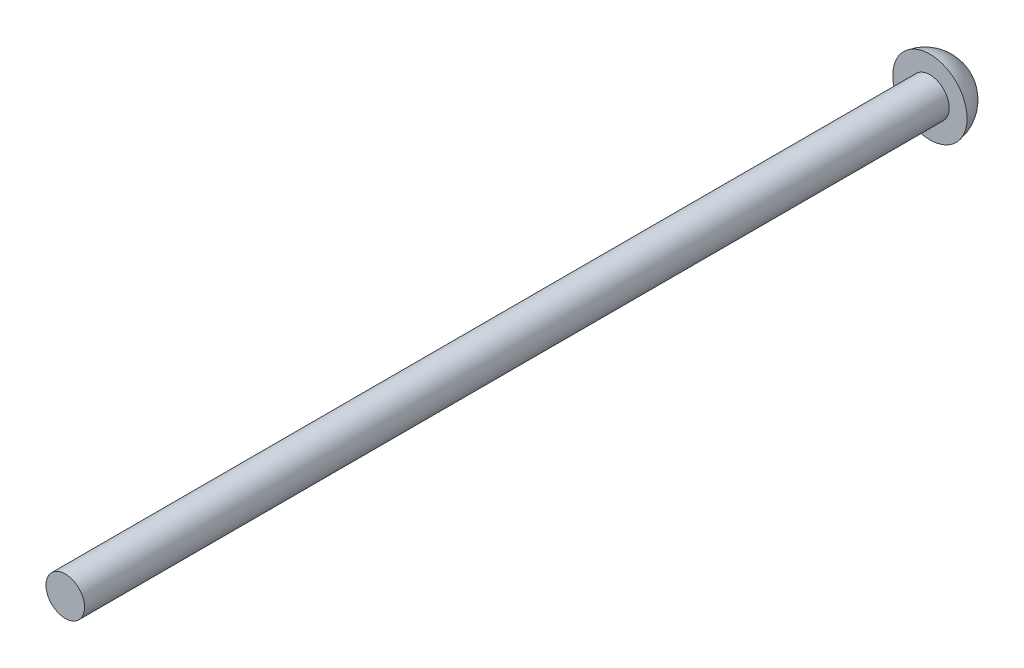
ISO-10303-21;
HEADER;
FILE_DESCRIPTION(('STEP AP214'),'2;1');
FILE_NAME('part.step','',(''),(''),'','','');
FILE_SCHEMA(('AUTOMOTIVE_DESIGN { 1 0 10303 214 1 1 1 1 }'));
ENDSEC;
DATA;
#1=APPLICATION_CONTEXT('core data for automotive mechanical design processes');
#2=APPLICATION_PROTOCOL_DEFINITION('international standard','automotive_design',2000,#1);
#3=PRODUCT_CONTEXT('',#1,'mechanical');
#4=PRODUCT('Part','Part','',(#3));
#5=PRODUCT_RELATED_PRODUCT_CATEGORY('part','',(#4));
#6=PRODUCT_DEFINITION_FORMATION('','',#4);
#7=PRODUCT_DEFINITION_CONTEXT('part definition',#1,'design');
#8=PRODUCT_DEFINITION('design','',#6,#7);
#9=PRODUCT_DEFINITION_SHAPE('','',#8);
#10=(LENGTH_UNIT() NAMED_UNIT(*) SI_UNIT(.MILLI.,.METRE.));
#11=(NAMED_UNIT(*) PLANE_ANGLE_UNIT() SI_UNIT($,.RADIAN.));
#12=(NAMED_UNIT(*) SI_UNIT($,.STERADIAN.) SOLID_ANGLE_UNIT());
#13=UNCERTAINTY_MEASURE_WITH_UNIT(LENGTH_MEASURE(1.E-05),#10,'distance_accuracy_value','');
#14=(GEOMETRIC_REPRESENTATION_CONTEXT(3) GLOBAL_UNCERTAINTY_ASSIGNED_CONTEXT((#13)) GLOBAL_UNIT_ASSIGNED_CONTEXT((#10,
#11,#12)) REPRESENTATION_CONTEXT('',''));
#15=CARTESIAN_POINT('',(0.,0.,0.));
#16=DIRECTION('',(0.,0.,1.));
#17=DIRECTION('',(1.,0.,0.));
#18=AXIS2_PLACEMENT_3D('',#15,#16,#17);
#19=CARTESIAN_POINT('',(0.,0.,0.));
#20=DIRECTION('',(0.,0.,1.));
#21=DIRECTION('',(1.,0.,0.));
#22=AXIS2_PLACEMENT_3D('',#19,#20,#21);
#23=PLANE('',#22);
#24=CARTESIAN_POINT('',(0.,0.,0.));
#25=DIRECTION('',(0.,0.,1.));
#26=DIRECTION('',(1.,0.,0.));
#27=AXIS2_PLACEMENT_3D('',#24,#25,#26);
#28=CIRCLE('',#27,1.7);
#29=CARTESIAN_POINT('',(1.7,0.,0.));
#30=VERTEX_POINT('',#29);
#31=EDGE_CURVE('E10',#30,#30,#28,.T.);
#32=ORIENTED_EDGE('',*,*,#31,.T.);
#33=EDGE_LOOP('',(#32));
#34=FACE_BOUND('',#33,.T.);
#35=ADVANCED_FACE('F31',(#34),#23,.T.);
#36=CARTESIAN_POINT('',(0.,0.,0.));
#37=DIRECTION('',(0.,0.,1.));
#38=DIRECTION('',(1.,0.,0.));
#39=AXIS2_PLACEMENT_3D('',#36,#37,#38);
#40=CYLINDRICAL_SURFACE('',#39,1.7);
#41=CARTESIAN_POINT('',(0.,0.,-76.2));
#42=DIRECTION('',(0.,0.,1.));
#43=DIRECTION('',(1.,0.,0.));
#44=AXIS2_PLACEMENT_3D('',#41,#42,#43);
#45=CIRCLE('',#44,1.7);
#46=CARTESIAN_POINT('',(1.7,0.,-76.2));
#47=VERTEX_POINT('',#46);
#48=EDGE_CURVE('E37',#47,#47,#45,.T.);
#49=ORIENTED_EDGE('',*,*,#48,.T.);
#50=EDGE_LOOP('',(#49));
#51=FACE_BOUND('',#50,.T.);
#52=ORIENTED_EDGE('',*,*,#31,.F.);
#53=EDGE_LOOP('',(#52));
#54=FACE_BOUND('',#53,.T.);
#55=ADVANCED_FACE('F57',(#51,#54),#40,.T.);
#56=CARTESIAN_POINT('',(1.7,0.,-76.2));
#57=DIRECTION('',(0.,0.,1.));
#58=DIRECTION('',(1.,0.,0.));
#59=AXIS2_PLACEMENT_3D('',#56,#57,#58);
#60=PLANE('',#59);
#61=CARTESIAN_POINT('',(0.,0.,-76.2));
#62=DIRECTION('',(0.,0.,1.));
#63=DIRECTION('',(1.,0.,0.));
#64=AXIS2_PLACEMENT_3D('',#61,#62,#63);
#65=CIRCLE('',#64,3.275);
#66=CARTESIAN_POINT('',(3.275,0.,-76.2));
#67=VERTEX_POINT('',#66);
#68=EDGE_CURVE('E41',#67,#67,#65,.T.);
#69=ORIENTED_EDGE('',*,*,#68,.T.);
#70=EDGE_LOOP('',(#69));
#71=FACE_BOUND('',#70,.T.);
#72=ORIENTED_EDGE('',*,*,#48,.F.);
#73=EDGE_LOOP('',(#72));
#74=FACE_BOUND('',#73,.T.);
#75=ADVANCED_FACE('F48',(#71,#74),#60,.T.);
#76=CARTESIAN_POINT('',(0.,0.,-75.7664242160279));
#77=DIRECTION('',(0.,0.,1.));
#78=DIRECTION('',(1.,0.,0.));
#79=AXIS2_PLACEMENT_3D('',#76,#77,#78);
#80=SPHERICAL_SURFACE('',#79,3.30357578397213);
#81=ORIENTED_EDGE('',*,*,#68,.F.);
#82=EDGE_LOOP('',(#81));
#83=FACE_BOUND('',#82,.T.);
#84=ADVANCED_FACE('F51',(#83),#80,.T.);
#85=CLOSED_SHELL('',(#35,#55,#75,#84));
#86=MANIFOLD_SOLID_BREP('B2',#85);
#87=ADVANCED_BREP_SHAPE_REPRESENTATION('',(#18,#86),#14);
#88=SHAPE_DEFINITION_REPRESENTATION(#9,#87);
ENDSEC;
END-ISO-10303-21;
